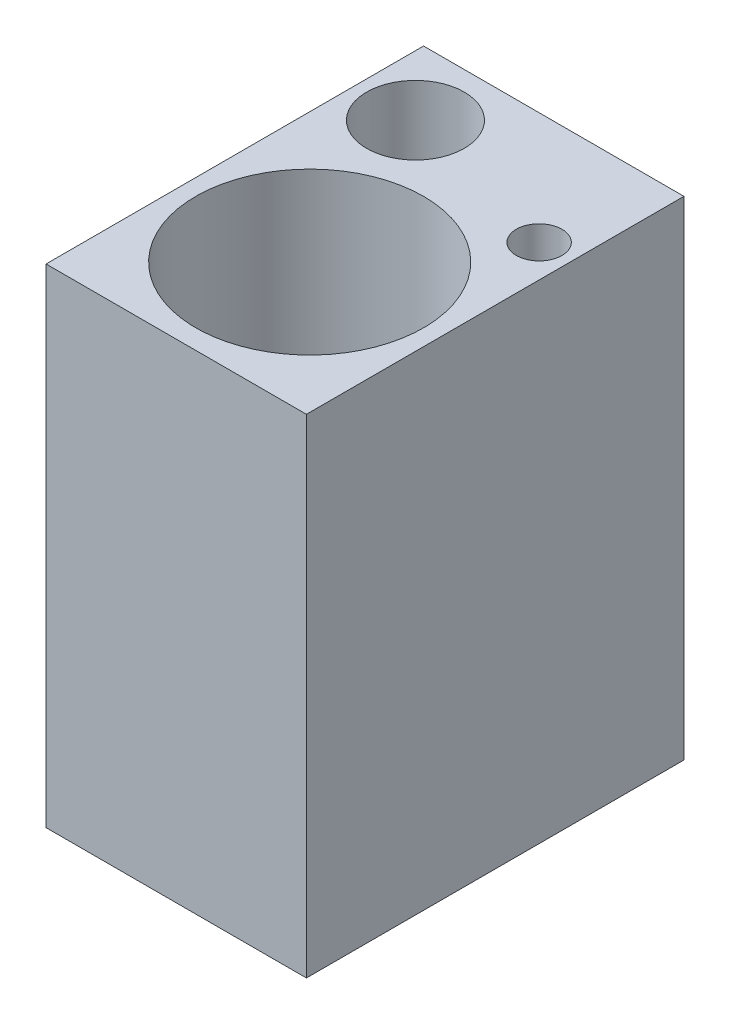
ISO-10303-21;
HEADER;
FILE_DESCRIPTION(('STEP AP214'),'2;1');
FILE_NAME('part.step','',(''),(''),'','','');
FILE_SCHEMA(('AUTOMOTIVE_DESIGN { 1 0 10303 214 1 1 1 1 }'));
ENDSEC;
DATA;
#1=APPLICATION_CONTEXT('core data for automotive mechanical design processes');
#2=APPLICATION_PROTOCOL_DEFINITION('international standard','automotive_design',2000,#1);
#3=PRODUCT_CONTEXT('',#1,'mechanical');
#4=PRODUCT('Part','Part','',(#3));
#5=PRODUCT_RELATED_PRODUCT_CATEGORY('part','',(#4));
#6=PRODUCT_DEFINITION_FORMATION('','',#4);
#7=PRODUCT_DEFINITION_CONTEXT('part definition',#1,'design');
#8=PRODUCT_DEFINITION('design','',#6,#7);
#9=PRODUCT_DEFINITION_SHAPE('','',#8);
#10=(LENGTH_UNIT() NAMED_UNIT(*) SI_UNIT(.MILLI.,.METRE.));
#11=(NAMED_UNIT(*) PLANE_ANGLE_UNIT() SI_UNIT($,.RADIAN.));
#12=(NAMED_UNIT(*) SI_UNIT($,.STERADIAN.) SOLID_ANGLE_UNIT());
#13=UNCERTAINTY_MEASURE_WITH_UNIT(LENGTH_MEASURE(1.E-05),#10,'distance_accuracy_value','');
#14=(GEOMETRIC_REPRESENTATION_CONTEXT(3) GLOBAL_UNCERTAINTY_ASSIGNED_CONTEXT((#13)) GLOBAL_UNIT_ASSIGNED_CONTEXT((#10,
#11,#12)) REPRESENTATION_CONTEXT('',''));
#15=CARTESIAN_POINT('',(0.,0.,0.));
#16=DIRECTION('',(0.,0.,1.));
#17=DIRECTION('',(1.,0.,0.));
#18=AXIS2_PLACEMENT_3D('',#15,#16,#17);
#19=CARTESIAN_POINT('',(-42.5307676804839,8.78312116943215,20.6250000000002));
#20=DIRECTION('',(-1.,0.,0.));
#21=DIRECTION('',(0.,0.,1.));
#22=AXIS2_PLACEMENT_3D('',#19,#20,#21);
#23=PLANE('',#22);
#24=DIRECTION('',(0.,0.,-1.));
#25=VECTOR('',#24,1.);
#26=CARTESIAN_POINT('',(-42.5307676804839,-21.2168788305678,20.6250000000002));
#27=LINE('',#26,#25);
#28=CARTESIAN_POINT('',(-42.5307676804839,-21.2168788305678,20.6250000000002));
#29=VERTEX_POINT('',#28);
#30=CARTESIAN_POINT('',(-42.5307676804839,-21.2168788305678,-2.57499999999981));
#31=VERTEX_POINT('',#30);
#32=EDGE_CURVE('E104',#29,#31,#27,.T.);
#33=ORIENTED_EDGE('',*,*,#32,.F.);
#34=DIRECTION('',(0.,-1.,0.));
#35=VECTOR('',#34,1.);
#36=CARTESIAN_POINT('',(-42.5307676804839,8.78312116943215,20.6250000000002));
#37=LINE('',#36,#35);
#38=CARTESIAN_POINT('',(-42.5307676804839,8.78312116943215,20.6250000000002));
#39=VERTEX_POINT('',#38);
#40=EDGE_CURVE('E11',#39,#29,#37,.T.);
#41=ORIENTED_EDGE('',*,*,#40,.F.);
#42=DIRECTION('',(0.,0.,-1.));
#43=VECTOR('',#42,1.);
#44=CARTESIAN_POINT('',(-42.5307676804839,8.78312116943215,20.6250000000002));
#45=LINE('',#44,#43);
#46=CARTESIAN_POINT('',(-42.5307676804839,8.78312116943215,-2.57499999999981));
#47=VERTEX_POINT('',#46);
#48=EDGE_CURVE('E97',#39,#47,#45,.T.);
#49=ORIENTED_EDGE('',*,*,#48,.T.);
#50=DIRECTION('',(0.,-1.,0.));
#51=VECTOR('',#50,1.);
#52=CARTESIAN_POINT('',(-42.5307676804839,8.78312116943215,-2.57499999999981));
#53=LINE('',#52,#51);
#54=EDGE_CURVE('E42',#47,#31,#53,.T.);
#55=ORIENTED_EDGE('',*,*,#54,.T.);
#56=EDGE_LOOP('',(#33,#41,#49,#55));
#57=FACE_BOUND('',#56,.T.);
#58=ADVANCED_FACE('F39',(#57),#23,.T.);
#59=CARTESIAN_POINT('',(-42.5307676804839,8.78312116943215,20.6250000000002));
#60=DIRECTION('',(0.,0.,1.));
#61=DIRECTION('',(1.,0.,0.));
#62=AXIS2_PLACEMENT_3D('',#59,#60,#61);
#63=PLANE('',#62);
#64=DIRECTION('',(-1.,0.,0.));
#65=VECTOR('',#64,1.);
#66=CARTESIAN_POINT('',(-42.5307676804839,-21.2168788305678,20.6250000000002));
#67=LINE('',#66,#65);
#68=CARTESIAN_POINT('',(-26.5307676804839,-21.2168788305678,20.6250000000002));
#69=VERTEX_POINT('',#68);
#70=EDGE_CURVE('E99',#69,#29,#67,.T.);
#71=ORIENTED_EDGE('',*,*,#70,.F.);
#72=DIRECTION('',(0.,-1.,0.));
#73=VECTOR('',#72,1.);
#74=CARTESIAN_POINT('',(-26.5307676804839,8.78312116943215,20.6250000000002));
#75=LINE('',#74,#73);
#76=CARTESIAN_POINT('',(-26.5307676804839,8.78312116943215,20.6250000000002));
#77=VERTEX_POINT('',#76);
#78=EDGE_CURVE('E48',#77,#69,#75,.T.);
#79=ORIENTED_EDGE('',*,*,#78,.F.);
#80=DIRECTION('',(-1.,0.,0.));
#81=VECTOR('',#80,1.);
#82=CARTESIAN_POINT('',(-42.5307676804839,8.78312116943215,20.6250000000002));
#83=LINE('',#82,#81);
#84=EDGE_CURVE('E94',#77,#39,#83,.T.);
#85=ORIENTED_EDGE('',*,*,#84,.T.);
#86=ORIENTED_EDGE('',*,*,#40,.T.);
#87=EDGE_LOOP('',(#71,#79,#85,#86));
#88=FACE_BOUND('',#87,.T.);
#89=ADVANCED_FACE('F115',(#88),#63,.T.);
#90=CARTESIAN_POINT('',(-26.5307676804839,8.78312116943215,20.6250000000002));
#91=DIRECTION('',(1.,0.,0.));
#92=DIRECTION('',(0.,0.,-1.));
#93=AXIS2_PLACEMENT_3D('',#90,#91,#92);
#94=PLANE('',#93);
#95=DIRECTION('',(0.,0.,1.));
#96=VECTOR('',#95,1.);
#97=CARTESIAN_POINT('',(-26.5307676804839,-21.2168788305678,20.6250000000002));
#98=LINE('',#97,#96);
#99=CARTESIAN_POINT('',(-26.5307676804839,-21.2168788305678,-2.5749999999998));
#100=VERTEX_POINT('',#99);
#101=EDGE_CURVE('E89',#100,#69,#98,.T.);
#102=ORIENTED_EDGE('',*,*,#101,.F.);
#103=DIRECTION('',(0.,-1.,0.));
#104=VECTOR('',#103,1.);
#105=CARTESIAN_POINT('',(-26.5307676804839,8.78312116943215,-2.5749999999998));
#106=LINE('',#105,#104);
#107=CARTESIAN_POINT('',(-26.5307676804839,8.78312116943215,-2.5749999999998));
#108=VERTEX_POINT('',#107);
#109=EDGE_CURVE('E84',#108,#100,#106,.T.);
#110=ORIENTED_EDGE('',*,*,#109,.F.);
#111=DIRECTION('',(0.,0.,1.));
#112=VECTOR('',#111,1.);
#113=CARTESIAN_POINT('',(-26.5307676804839,8.78312116943215,20.6250000000002));
#114=LINE('',#113,#112);
#115=EDGE_CURVE('E87',#108,#77,#114,.T.);
#116=ORIENTED_EDGE('',*,*,#115,.T.);
#117=ORIENTED_EDGE('',*,*,#78,.T.);
#118=EDGE_LOOP('',(#102,#110,#116,#117));
#119=FACE_BOUND('',#118,.T.);
#120=ADVANCED_FACE('F86',(#119),#94,.T.);
#121=CARTESIAN_POINT('',(-42.5307676804839,8.78312116943215,-2.57499999999981));
#122=DIRECTION('',(0.,0.,-1.));
#123=DIRECTION('',(-1.,0.,0.));
#124=AXIS2_PLACEMENT_3D('',#121,#122,#123);
#125=PLANE('',#124);
#126=DIRECTION('',(1.,0.,0.));
#127=VECTOR('',#126,1.);
#128=CARTESIAN_POINT('',(-42.5307676804839,-21.2168788305678,-2.57499999999981));
#129=LINE('',#128,#127);
#130=EDGE_CURVE('E107',#31,#100,#129,.T.);
#131=ORIENTED_EDGE('',*,*,#130,.F.);
#132=ORIENTED_EDGE('',*,*,#54,.F.);
#133=DIRECTION('',(1.,0.,0.));
#134=VECTOR('',#133,1.);
#135=CARTESIAN_POINT('',(-42.5307676804839,8.78312116943215,-2.57499999999981));
#136=LINE('',#135,#134);
#137=EDGE_CURVE('E93',#47,#108,#136,.T.);
#138=ORIENTED_EDGE('',*,*,#137,.T.);
#139=ORIENTED_EDGE('',*,*,#109,.T.);
#140=EDGE_LOOP('',(#131,#132,#138,#139));
#141=FACE_BOUND('',#140,.T.);
#142=ADVANCED_FACE('F96',(#141),#125,.T.);
#143=CARTESIAN_POINT('',(0.,8.78312116943215,0.));
#144=DIRECTION('',(0.,-1.,0.));
#145=DIRECTION('',(0.,0.,-1.));
#146=AXIS2_PLACEMENT_3D('',#143,#144,#145);
#147=PLANE('',#146);
#148=CARTESIAN_POINT('',(-38.8307676804839,8.78312116943215,1.62500000000019));
#149=DIRECTION('',(0.,-1.,0.));
#150=DIRECTION('',(0.,0.,-1.));
#151=AXIS2_PLACEMENT_3D('',#148,#149,#150);
#152=CIRCLE('',#151,3.);
#153=CARTESIAN_POINT('',(-38.8307676804839,8.78312116943215,-1.37499999999981));
#154=VERTEX_POINT('',#153);
#155=EDGE_CURVE('E152',#154,#154,#152,.T.);
#156=ORIENTED_EDGE('',*,*,#155,.T.);
#157=EDGE_LOOP('',(#156));
#158=FACE_BOUND('',#157,.T.);
#159=CARTESIAN_POINT('',(-28.5307676804839,8.78312116943215,4.32500000000019));
#160=DIRECTION('',(0.,-1.,0.));
#161=DIRECTION('',(0.,0.,-1.));
#162=AXIS2_PLACEMENT_3D('',#159,#160,#161);
#163=CIRCLE('',#162,1.4);
#164=CARTESIAN_POINT('',(-28.5307676804839,8.78312116943215,2.92500000000019));
#165=VERTEX_POINT('',#164);
#166=EDGE_CURVE('E160',#165,#165,#163,.T.);
#167=ORIENTED_EDGE('',*,*,#166,.T.);
#168=EDGE_LOOP('',(#167));
#169=FACE_BOUND('',#168,.T.);
#170=CARTESIAN_POINT('',(-34.5307676804839,8.78312116943215,12.4250000000002));
#171=DIRECTION('',(0.,-1.,0.));
#172=DIRECTION('',(0.,0.,-1.));
#173=AXIS2_PLACEMENT_3D('',#170,#171,#172);
#174=CIRCLE('',#173,7.);
#175=CARTESIAN_POINT('',(-34.5307676804839,8.78312116943215,5.42500000000019));
#176=VERTEX_POINT('',#175);
#177=EDGE_CURVE('E108',#176,#176,#174,.T.);
#178=ORIENTED_EDGE('',*,*,#177,.T.);
#179=EDGE_LOOP('',(#178));
#180=FACE_BOUND('',#179,.T.);
#181=ORIENTED_EDGE('',*,*,#48,.F.);
#182=ORIENTED_EDGE('',*,*,#84,.F.);
#183=ORIENTED_EDGE('',*,*,#115,.F.);
#184=ORIENTED_EDGE('',*,*,#137,.F.);
#185=EDGE_LOOP('',(#181,#182,#183,#184));
#186=FACE_BOUND('',#185,.T.);
#187=ADVANCED_FACE('F92',(#158,#169,#180,#186),#147,.F.);
#188=CARTESIAN_POINT('',(0.,-21.2168788305678,0.));
#189=DIRECTION('',(0.,-1.,0.));
#190=DIRECTION('',(0.,0.,-1.));
#191=AXIS2_PLACEMENT_3D('',#188,#189,#190);
#192=PLANE('',#191);
#193=CARTESIAN_POINT('',(-38.8307676804839,-21.2168788305678,1.62500000000019));
#194=DIRECTION('',(0.,-1.,0.));
#195=DIRECTION('',(0.,0.,-1.));
#196=AXIS2_PLACEMENT_3D('',#193,#194,#195);
#197=CIRCLE('',#196,3.);
#198=CARTESIAN_POINT('',(-38.8307676804839,-21.2168788305678,-1.37499999999981));
#199=VERTEX_POINT('',#198);
#200=EDGE_CURVE('E155',#199,#199,#197,.T.);
#201=ORIENTED_EDGE('',*,*,#200,.F.);
#202=EDGE_LOOP('',(#201));
#203=FACE_BOUND('',#202,.T.);
#204=CARTESIAN_POINT('',(-28.5307676804839,-21.2168788305678,4.32500000000019));
#205=DIRECTION('',(0.,-1.,0.));
#206=DIRECTION('',(0.,0.,-1.));
#207=AXIS2_PLACEMENT_3D('',#204,#205,#206);
#208=CIRCLE('',#207,1.4);
#209=CARTESIAN_POINT('',(-28.5307676804839,-21.2168788305678,2.92500000000019));
#210=VERTEX_POINT('',#209);
#211=EDGE_CURVE('E157',#210,#210,#208,.T.);
#212=ORIENTED_EDGE('',*,*,#211,.F.);
#213=EDGE_LOOP('',(#212));
#214=FACE_BOUND('',#213,.T.);
#215=CARTESIAN_POINT('',(-34.5307676804839,-21.2168788305678,12.4250000000002));
#216=DIRECTION('',(0.,-1.,0.));
#217=DIRECTION('',(0.,0.,-1.));
#218=AXIS2_PLACEMENT_3D('',#215,#216,#217);
#219=CIRCLE('',#218,7.);
#220=CARTESIAN_POINT('',(-34.5307676804839,-21.2168788305678,5.42500000000019));
#221=VERTEX_POINT('',#220);
#222=EDGE_CURVE('E163',#221,#221,#219,.T.);
#223=ORIENTED_EDGE('',*,*,#222,.F.);
#224=EDGE_LOOP('',(#223));
#225=FACE_BOUND('',#224,.T.);
#226=ORIENTED_EDGE('',*,*,#32,.T.);
#227=ORIENTED_EDGE('',*,*,#130,.T.);
#228=ORIENTED_EDGE('',*,*,#101,.T.);
#229=ORIENTED_EDGE('',*,*,#70,.T.);
#230=EDGE_LOOP('',(#226,#227,#228,#229));
#231=FACE_BOUND('',#230,.T.);
#232=ADVANCED_FACE('F114',(#203,#214,#225,#231),#192,.T.);
#233=CARTESIAN_POINT('',(-34.5307676804839,8.78312116943215,12.4250000000002));
#234=DIRECTION('',(0.,-1.,0.));
#235=DIRECTION('',(0.,0.,-1.));
#236=AXIS2_PLACEMENT_3D('',#233,#234,#235);
#237=CYLINDRICAL_SURFACE('',#236,7.);
#238=ORIENTED_EDGE('',*,*,#177,.F.);
#239=EDGE_LOOP('',(#238));
#240=FACE_BOUND('',#239,.T.);
#241=ORIENTED_EDGE('',*,*,#222,.T.);
#242=EDGE_LOOP('',(#241));
#243=FACE_BOUND('',#242,.T.);
#244=ADVANCED_FACE('F133',(#240,#243),#237,.F.);
#245=CARTESIAN_POINT('',(-28.5307676804839,8.78312116943215,4.32500000000019));
#246=DIRECTION('',(0.,-1.,0.));
#247=DIRECTION('',(0.,0.,-1.));
#248=AXIS2_PLACEMENT_3D('',#245,#246,#247);
#249=CYLINDRICAL_SURFACE('',#248,1.4);
#250=ORIENTED_EDGE('',*,*,#166,.F.);
#251=EDGE_LOOP('',(#250));
#252=FACE_BOUND('',#251,.T.);
#253=ORIENTED_EDGE('',*,*,#211,.T.);
#254=EDGE_LOOP('',(#253));
#255=FACE_BOUND('',#254,.T.);
#256=ADVANCED_FACE('F140',(#252,#255),#249,.F.);
#257=CARTESIAN_POINT('',(-38.8307676804839,8.78312116943215,1.62500000000019));
#258=DIRECTION('',(0.,-1.,0.));
#259=DIRECTION('',(0.,0.,-1.));
#260=AXIS2_PLACEMENT_3D('',#257,#258,#259);
#261=CYLINDRICAL_SURFACE('',#260,3.);
#262=ORIENTED_EDGE('',*,*,#155,.F.);
#263=EDGE_LOOP('',(#262));
#264=FACE_BOUND('',#263,.T.);
#265=ORIENTED_EDGE('',*,*,#200,.T.);
#266=EDGE_LOOP('',(#265));
#267=FACE_BOUND('',#266,.T.);
#268=ADVANCED_FACE('F144',(#264,#267),#261,.F.);
#269=CLOSED_SHELL('',(#58,#89,#120,#142,#187,#232,#244,#256,#268));
#270=MANIFOLD_SOLID_BREP('B2',#269);
#271=ADVANCED_BREP_SHAPE_REPRESENTATION('',(#18,#270),#14);
#272=SHAPE_DEFINITION_REPRESENTATION(#9,#271);
ENDSEC;
END-ISO-10303-21;
